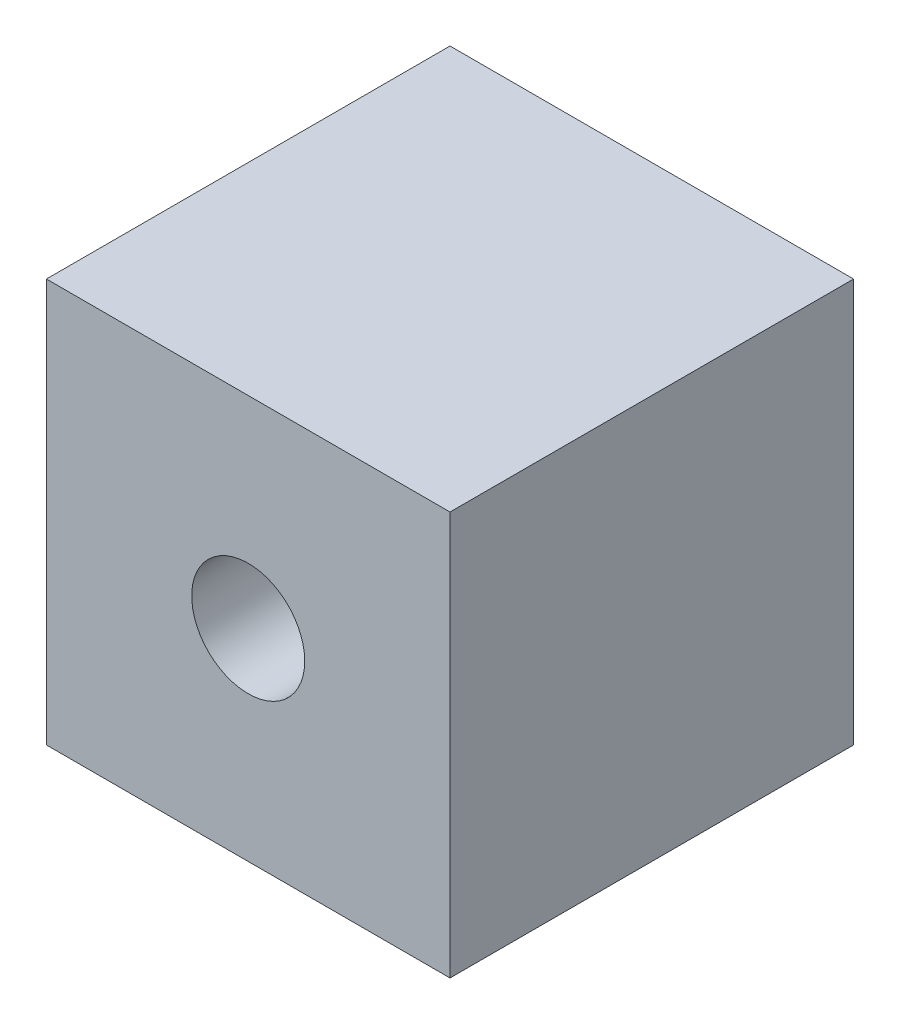
ISO-10303-21;
HEADER;
FILE_DESCRIPTION(('STEP AP214'),'2;1');
FILE_NAME('part.step','',(''),(''),'','','');
FILE_SCHEMA(('AUTOMOTIVE_DESIGN { 1 0 10303 214 1 1 1 1 }'));
ENDSEC;
DATA;
#1=APPLICATION_CONTEXT('core data for automotive mechanical design processes');
#2=APPLICATION_PROTOCOL_DEFINITION('international standard','automotive_design',2000,#1);
#3=PRODUCT_CONTEXT('',#1,'mechanical');
#4=PRODUCT('Part','Part','',(#3));
#5=PRODUCT_RELATED_PRODUCT_CATEGORY('part','',(#4));
#6=PRODUCT_DEFINITION_FORMATION('','',#4);
#7=PRODUCT_DEFINITION_CONTEXT('part definition',#1,'design');
#8=PRODUCT_DEFINITION('design','',#6,#7);
#9=PRODUCT_DEFINITION_SHAPE('','',#8);
#10=(LENGTH_UNIT() NAMED_UNIT(*) SI_UNIT(.MILLI.,.METRE.));
#11=(NAMED_UNIT(*) PLANE_ANGLE_UNIT() SI_UNIT($,.RADIAN.));
#12=(NAMED_UNIT(*) SI_UNIT($,.STERADIAN.) SOLID_ANGLE_UNIT());
#13=UNCERTAINTY_MEASURE_WITH_UNIT(LENGTH_MEASURE(1.E-05),#10,'distance_accuracy_value','');
#14=(GEOMETRIC_REPRESENTATION_CONTEXT(3) GLOBAL_UNCERTAINTY_ASSIGNED_CONTEXT((#13)) GLOBAL_UNIT_ASSIGNED_CONTEXT((#10,
#11,#12)) REPRESENTATION_CONTEXT('',''));
#15=CARTESIAN_POINT('',(0.,0.,0.));
#16=DIRECTION('',(0.,0.,1.));
#17=DIRECTION('',(1.,0.,0.));
#18=AXIS2_PLACEMENT_3D('',#15,#16,#17);
#19=CARTESIAN_POINT('',(0.,0.,10.));
#20=DIRECTION('',(0.,0.,1.));
#21=DIRECTION('',(1.,0.,0.));
#22=AXIS2_PLACEMENT_3D('',#19,#20,#21);
#23=PLANE('',#22);
#24=DIRECTION('',(0.,1.,0.));
#25=VECTOR('',#24,1.);
#26=CARTESIAN_POINT('',(5.,5.,10.));
#27=LINE('',#26,#25);
#28=CARTESIAN_POINT('',(5.,-5.,10.));
#29=VERTEX_POINT('',#28);
#30=CARTESIAN_POINT('',(5.,5.,10.));
#31=VERTEX_POINT('',#30);
#32=EDGE_CURVE('E92',#29,#31,#27,.T.);
#33=ORIENTED_EDGE('',*,*,#32,.T.);
#34=DIRECTION('',(-1.,0.,0.));
#35=VECTOR('',#34,1.);
#36=CARTESIAN_POINT('',(-5.,5.,10.));
#37=LINE('',#36,#35);
#38=CARTESIAN_POINT('',(-5.,5.,10.));
#39=VERTEX_POINT('',#38);
#40=EDGE_CURVE('E87',#31,#39,#37,.T.);
#41=ORIENTED_EDGE('',*,*,#40,.T.);
#42=DIRECTION('',(0.,-1.,0.));
#43=VECTOR('',#42,1.);
#44=CARTESIAN_POINT('',(-5.,5.,10.));
#45=LINE('',#44,#43);
#46=CARTESIAN_POINT('',(-5.,-5.,10.));
#47=VERTEX_POINT('',#46);
#48=EDGE_CURVE('E90',#39,#47,#45,.T.);
#49=ORIENTED_EDGE('',*,*,#48,.T.);
#50=DIRECTION('',(1.,0.,0.));
#51=VECTOR('',#50,1.);
#52=CARTESIAN_POINT('',(-5.,-5.,10.));
#53=LINE('',#52,#51);
#54=EDGE_CURVE('E57',#47,#29,#53,.T.);
#55=ORIENTED_EDGE('',*,*,#54,.T.);
#56=EDGE_LOOP('',(#33,#41,#49,#55));
#57=FACE_BOUND('',#56,.T.);
#58=CARTESIAN_POINT('',(0.,0.,10.));
#59=DIRECTION('',(0.,0.,1.));
#60=DIRECTION('',(1.,0.,0.));
#61=AXIS2_PLACEMENT_3D('',#58,#59,#60);
#62=CIRCLE('',#61,1.4);
#63=CARTESIAN_POINT('',(1.4,0.,10.));
#64=VERTEX_POINT('',#63);
#65=EDGE_CURVE('E112',#64,#64,#62,.T.);
#66=ORIENTED_EDGE('',*,*,#65,.F.);
#67=EDGE_LOOP('',(#66));
#68=FACE_BOUND('',#67,.T.);
#69=ADVANCED_FACE('F39',(#57,#68),#23,.T.);
#70=CARTESIAN_POINT('',(0.,0.,0.));
#71=DIRECTION('',(0.,0.,1.));
#72=DIRECTION('',(1.,0.,0.));
#73=AXIS2_PLACEMENT_3D('',#70,#71,#72);
#74=PLANE('',#73);
#75=DIRECTION('',(0.,1.,0.));
#76=VECTOR('',#75,1.);
#77=CARTESIAN_POINT('',(5.,5.,0.));
#78=LINE('',#77,#76);
#79=CARTESIAN_POINT('',(5.,-5.,0.));
#80=VERTEX_POINT('',#79);
#81=CARTESIAN_POINT('',(5.,5.,0.));
#82=VERTEX_POINT('',#81);
#83=EDGE_CURVE('E108',#80,#82,#78,.T.);
#84=ORIENTED_EDGE('',*,*,#83,.F.);
#85=DIRECTION('',(1.,0.,0.));
#86=VECTOR('',#85,1.);
#87=CARTESIAN_POINT('',(-5.,-5.,0.));
#88=LINE('',#87,#86);
#89=CARTESIAN_POINT('',(-5.,-5.,0.));
#90=VERTEX_POINT('',#89);
#91=EDGE_CURVE('E80',#90,#80,#88,.T.);
#92=ORIENTED_EDGE('',*,*,#91,.F.);
#93=DIRECTION('',(0.,-1.,0.));
#94=VECTOR('',#93,1.);
#95=CARTESIAN_POINT('',(-5.,5.,0.));
#96=LINE('',#95,#94);
#97=CARTESIAN_POINT('',(-5.,5.,0.));
#98=VERTEX_POINT('',#97);
#99=EDGE_CURVE('E74',#98,#90,#96,.T.);
#100=ORIENTED_EDGE('',*,*,#99,.F.);
#101=DIRECTION('',(-1.,0.,0.));
#102=VECTOR('',#101,1.);
#103=CARTESIAN_POINT('',(-5.,5.,0.));
#104=LINE('',#103,#102);
#105=EDGE_CURVE('E97',#82,#98,#104,.T.);
#106=ORIENTED_EDGE('',*,*,#105,.F.);
#107=EDGE_LOOP('',(#84,#92,#100,#106));
#108=FACE_BOUND('',#107,.T.);
#109=CARTESIAN_POINT('',(0.,0.,0.));
#110=DIRECTION('',(0.,0.,1.));
#111=DIRECTION('',(1.,0.,0.));
#112=AXIS2_PLACEMENT_3D('',#109,#110,#111);
#113=CIRCLE('',#112,1.4);
#114=CARTESIAN_POINT('',(1.4,0.,0.));
#115=VERTEX_POINT('',#114);
#116=EDGE_CURVE('E130',#115,#115,#113,.T.);
#117=ORIENTED_EDGE('',*,*,#116,.T.);
#118=EDGE_LOOP('',(#117));
#119=FACE_BOUND('',#118,.T.);
#120=ADVANCED_FACE('F125',(#108,#119),#74,.F.);
#121=CARTESIAN_POINT('',(5.,5.,10.));
#122=DIRECTION('',(-1.,0.,0.));
#123=DIRECTION('',(0.,-1.,0.));
#124=AXIS2_PLACEMENT_3D('',#121,#122,#123);
#125=PLANE('',#124);
#126=ORIENTED_EDGE('',*,*,#83,.T.);
#127=DIRECTION('',(0.,0.,-1.));
#128=VECTOR('',#127,1.);
#129=CARTESIAN_POINT('',(5.,5.,10.));
#130=LINE('',#129,#128);
#131=EDGE_CURVE('E11',#31,#82,#130,.T.);
#132=ORIENTED_EDGE('',*,*,#131,.F.);
#133=ORIENTED_EDGE('',*,*,#32,.F.);
#134=DIRECTION('',(0.,0.,-1.));
#135=VECTOR('',#134,1.);
#136=CARTESIAN_POINT('',(5.,-5.,10.));
#137=LINE('',#136,#135);
#138=EDGE_CURVE('E104',#29,#80,#137,.T.);
#139=ORIENTED_EDGE('',*,*,#138,.T.);
#140=EDGE_LOOP('',(#126,#132,#133,#139));
#141=FACE_BOUND('',#140,.T.);
#142=ADVANCED_FACE('F41',(#141),#125,.F.);
#143=CARTESIAN_POINT('',(-5.,5.,10.));
#144=DIRECTION('',(0.,-1.,0.));
#145=DIRECTION('',(0.,0.,-1.));
#146=AXIS2_PLACEMENT_3D('',#143,#144,#145);
#147=PLANE('',#146);
#148=ORIENTED_EDGE('',*,*,#105,.T.);
#149=DIRECTION('',(0.,0.,-1.));
#150=VECTOR('',#149,1.);
#151=CARTESIAN_POINT('',(-5.,5.,10.));
#152=LINE('',#151,#150);
#153=EDGE_CURVE('E49',#39,#98,#152,.T.);
#154=ORIENTED_EDGE('',*,*,#153,.F.);
#155=ORIENTED_EDGE('',*,*,#40,.F.);
#156=ORIENTED_EDGE('',*,*,#131,.T.);
#157=EDGE_LOOP('',(#148,#154,#155,#156));
#158=FACE_BOUND('',#157,.T.);
#159=ADVANCED_FACE('F96',(#158),#147,.F.);
#160=CARTESIAN_POINT('',(-5.,5.,10.));
#161=DIRECTION('',(1.,0.,0.));
#162=DIRECTION('',(0.,1.,0.));
#163=AXIS2_PLACEMENT_3D('',#160,#161,#162);
#164=PLANE('',#163);
#165=ORIENTED_EDGE('',*,*,#99,.T.);
#166=DIRECTION('',(0.,0.,-1.));
#167=VECTOR('',#166,1.);
#168=CARTESIAN_POINT('',(-5.,-5.,10.));
#169=LINE('',#168,#167);
#170=EDGE_CURVE('E99',#47,#90,#169,.T.);
#171=ORIENTED_EDGE('',*,*,#170,.F.);
#172=ORIENTED_EDGE('',*,*,#48,.F.);
#173=ORIENTED_EDGE('',*,*,#153,.T.);
#174=EDGE_LOOP('',(#165,#171,#172,#173));
#175=FACE_BOUND('',#174,.T.);
#176=ADVANCED_FACE('F100',(#175),#164,.F.);
#177=CARTESIAN_POINT('',(-5.,-5.,10.));
#178=DIRECTION('',(0.,1.,0.));
#179=DIRECTION('',(0.,0.,1.));
#180=AXIS2_PLACEMENT_3D('',#177,#178,#179);
#181=PLANE('',#180);
#182=ORIENTED_EDGE('',*,*,#91,.T.);
#183=ORIENTED_EDGE('',*,*,#138,.F.);
#184=ORIENTED_EDGE('',*,*,#54,.F.);
#185=ORIENTED_EDGE('',*,*,#170,.T.);
#186=EDGE_LOOP('',(#182,#183,#184,#185));
#187=FACE_BOUND('',#186,.T.);
#188=ADVANCED_FACE('F122',(#187),#181,.F.);
#189=CARTESIAN_POINT('',(0.,0.,10.));
#190=DIRECTION('',(0.,0.,-1.));
#191=DIRECTION('',(-1.,0.,0.));
#192=AXIS2_PLACEMENT_3D('',#189,#190,#191);
#193=CYLINDRICAL_SURFACE('',#192,1.4);
#194=ORIENTED_EDGE('',*,*,#65,.T.);
#195=EDGE_LOOP('',(#194));
#196=FACE_BOUND('',#195,.T.);
#197=ORIENTED_EDGE('',*,*,#116,.F.);
#198=EDGE_LOOP('',(#197));
#199=FACE_BOUND('',#198,.T.);
#200=ADVANCED_FACE('F138',(#196,#199),#193,.F.);
#201=CLOSED_SHELL('',(#69,#120,#142,#159,#176,#188,#200));
#202=MANIFOLD_SOLID_BREP('B2',#201);
#203=ADVANCED_BREP_SHAPE_REPRESENTATION('',(#18,#202),#14);
#204=SHAPE_DEFINITION_REPRESENTATION(#9,#203);
ENDSEC;
END-ISO-10303-21;
